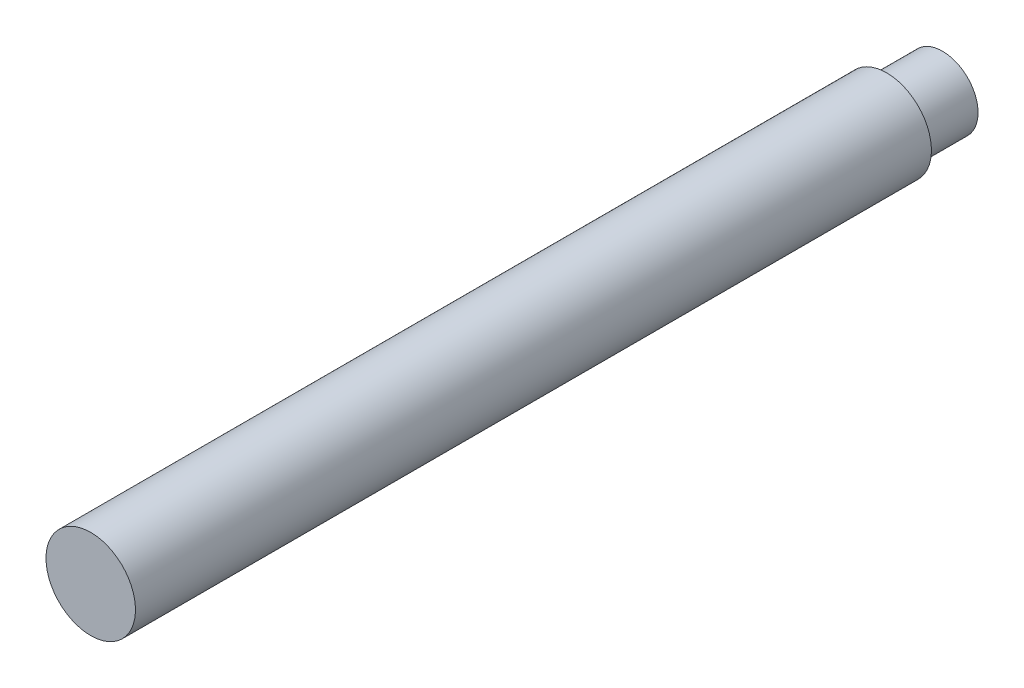
ISO-10303-21;
HEADER;
FILE_DESCRIPTION(('STEP AP214'),'2;1');
FILE_NAME('part.step','',(''),(''),'','','');
FILE_SCHEMA(('AUTOMOTIVE_DESIGN { 1 0 10303 214 1 1 1 1 }'));
ENDSEC;
DATA;
#1=APPLICATION_CONTEXT('core data for automotive mechanical design processes');
#2=APPLICATION_PROTOCOL_DEFINITION('international standard','automotive_design',2000,#1);
#3=PRODUCT_CONTEXT('',#1,'mechanical');
#4=PRODUCT('Part','Part','',(#3));
#5=PRODUCT_RELATED_PRODUCT_CATEGORY('part','',(#4));
#6=PRODUCT_DEFINITION_FORMATION('','',#4);
#7=PRODUCT_DEFINITION_CONTEXT('part definition',#1,'design');
#8=PRODUCT_DEFINITION('design','',#6,#7);
#9=PRODUCT_DEFINITION_SHAPE('','',#8);
#10=(LENGTH_UNIT() NAMED_UNIT(*) SI_UNIT(.MILLI.,.METRE.));
#11=(NAMED_UNIT(*) PLANE_ANGLE_UNIT() SI_UNIT($,.RADIAN.));
#12=(NAMED_UNIT(*) SI_UNIT($,.STERADIAN.) SOLID_ANGLE_UNIT());
#13=UNCERTAINTY_MEASURE_WITH_UNIT(LENGTH_MEASURE(1.E-05),#10,'distance_accuracy_value','');
#14=(GEOMETRIC_REPRESENTATION_CONTEXT(3) GLOBAL_UNCERTAINTY_ASSIGNED_CONTEXT((#13)) GLOBAL_UNIT_ASSIGNED_CONTEXT((#10,
#11,#12)) REPRESENTATION_CONTEXT('',''));
#15=CARTESIAN_POINT('',(0.,0.,0.));
#16=DIRECTION('',(0.,0.,1.));
#17=DIRECTION('',(1.,0.,0.));
#18=AXIS2_PLACEMENT_3D('',#15,#16,#17);
#19=CARTESIAN_POINT('',(0.,0.,76.2));
#20=DIRECTION('',(0.,0.,-1.));
#21=DIRECTION('',(-1.,0.,0.));
#22=AXIS2_PLACEMENT_3D('',#19,#20,#21);
#23=CYLINDRICAL_SURFACE('',#22,4.0005);
#24=CARTESIAN_POINT('',(0.,0.,76.2));
#25=DIRECTION('',(0.,0.,1.));
#26=DIRECTION('',(1.,0.,0.));
#27=AXIS2_PLACEMENT_3D('',#24,#25,#26);
#28=CIRCLE('',#27,4.0005);
#29=CARTESIAN_POINT('',(-4.0005,0.,76.2));
#30=VERTEX_POINT('',#29);
#31=EDGE_CURVE('E10',#30,#30,#28,.T.);
#32=CARTESIAN_POINT('',(0.,0.,5.));
#33=DIRECTION('',(0.,0.,-1.));
#34=DIRECTION('',(-1.,0.,0.));
#35=AXIS2_PLACEMENT_3D('',#32,#33,#34);
#36=CIRCLE('',#35,4.0005);
#37=CARTESIAN_POINT('',(-4.0005,0.,5.));
#38=VERTEX_POINT('',#37);
#39=EDGE_CURVE('E32',#38,#38,#36,.T.);
#40=CARTESIAN_POINT('',(-4.0005,0.,76.2));
#41=CARTESIAN_POINT('',(-4.0005,0.,75.4583333333333));
#42=CARTESIAN_POINT('',(-4.0005,0.,74.7166666666667));
#43=CARTESIAN_POINT('',(-4.0005,0.,73.2333333333333));
#44=CARTESIAN_POINT('',(-4.0005,0.,72.4916666666667));
#45=CARTESIAN_POINT('',(-4.0005,0.,71.0083333333333));
#46=CARTESIAN_POINT('',(-4.0005,0.,70.2666666666667));
#47=CARTESIAN_POINT('',(-4.0005,0.,68.7833333333333));
#48=CARTESIAN_POINT('',(-4.0005,0.,68.0416666666667));
#49=CARTESIAN_POINT('',(-4.0005,0.,66.5583333333333));
#50=CARTESIAN_POINT('',(-4.0005,0.,65.8166666666667));
#51=CARTESIAN_POINT('',(-4.0005,0.,64.3333333333333));
#52=CARTESIAN_POINT('',(-4.0005,0.,63.5916666666667));
#53=CARTESIAN_POINT('',(-4.0005,0.,62.1083333333333));
#54=CARTESIAN_POINT('',(-4.0005,0.,61.3666666666667));
#55=CARTESIAN_POINT('',(-4.0005,0.,59.8833333333333));
#56=CARTESIAN_POINT('',(-4.0005,0.,59.1416666666667));
#57=CARTESIAN_POINT('',(-4.0005,0.,57.6583333333333));
#58=CARTESIAN_POINT('',(-4.0005,0.,56.9166666666667));
#59=CARTESIAN_POINT('',(-4.0005,0.,55.4333333333333));
#60=CARTESIAN_POINT('',(-4.0005,0.,54.6916666666667));
#61=CARTESIAN_POINT('',(-4.0005,0.,53.2083333333333));
#62=CARTESIAN_POINT('',(-4.0005,0.,52.4666666666667));
#63=CARTESIAN_POINT('',(-4.0005,0.,50.9833333333333));
#64=CARTESIAN_POINT('',(-4.0005,0.,50.2416666666667));
#65=CARTESIAN_POINT('',(-4.0005,0.,48.7583333333333));
#66=CARTESIAN_POINT('',(-4.0005,0.,48.0166666666667));
#67=CARTESIAN_POINT('',(-4.0005,0.,46.5333333333333));
#68=CARTESIAN_POINT('',(-4.0005,0.,45.7916666666667));
#69=CARTESIAN_POINT('',(-4.0005,0.,44.3083333333333));
#70=CARTESIAN_POINT('',(-4.0005,0.,43.5666666666667));
#71=CARTESIAN_POINT('',(-4.0005,0.,42.0833333333333));
#72=CARTESIAN_POINT('',(-4.0005,0.,41.3416666666667));
#73=CARTESIAN_POINT('',(-4.0005,0.,39.8583333333333));
#74=CARTESIAN_POINT('',(-4.0005,0.,39.1166666666667));
#75=CARTESIAN_POINT('',(-4.0005,0.,37.6333333333333));
#76=CARTESIAN_POINT('',(-4.0005,0.,36.8916666666667));
#77=CARTESIAN_POINT('',(-4.0005,0.,35.4083333333333));
#78=CARTESIAN_POINT('',(-4.0005,0.,34.6666666666667));
#79=CARTESIAN_POINT('',(-4.0005,0.,33.1833333333333));
#80=CARTESIAN_POINT('',(-4.0005,0.,32.4416666666667));
#81=CARTESIAN_POINT('',(-4.0005,0.,30.9583333333333));
#82=CARTESIAN_POINT('',(-4.0005,0.,30.2166666666667));
#83=CARTESIAN_POINT('',(-4.0005,0.,28.7333333333333));
#84=CARTESIAN_POINT('',(-4.0005,0.,27.9916666666667));
#85=CARTESIAN_POINT('',(-4.0005,0.,26.5083333333333));
#86=CARTESIAN_POINT('',(-4.0005,0.,25.7666666666667));
#87=CARTESIAN_POINT('',(-4.0005,0.,24.2833333333333));
#88=CARTESIAN_POINT('',(-4.0005,0.,23.5416666666667));
#89=CARTESIAN_POINT('',(-4.0005,0.,22.0583333333333));
#90=CARTESIAN_POINT('',(-4.0005,0.,21.3166666666667));
#91=CARTESIAN_POINT('',(-4.0005,0.,19.8333333333333));
#92=CARTESIAN_POINT('',(-4.0005,0.,19.0916666666667));
#93=CARTESIAN_POINT('',(-4.0005,0.,17.6083333333333));
#94=CARTESIAN_POINT('',(-4.0005,0.,16.8666666666667));
#95=CARTESIAN_POINT('',(-4.0005,0.,15.3833333333333));
#96=CARTESIAN_POINT('',(-4.0005,0.,14.6416666666667));
#97=CARTESIAN_POINT('',(-4.0005,0.,13.1583333333333));
#98=CARTESIAN_POINT('',(-4.0005,0.,12.4166666666667));
#99=CARTESIAN_POINT('',(-4.0005,0.,10.9333333333333));
#100=CARTESIAN_POINT('',(-4.0005,0.,10.1916666666667));
#101=CARTESIAN_POINT('',(-4.0005,0.,8.70833333333334));
#102=CARTESIAN_POINT('',(-4.0005,0.,7.96666666666667));
#103=CARTESIAN_POINT('',(-4.0005,0.,6.48333333333334));
#104=CARTESIAN_POINT('',(-4.0005,0.,5.74166666666667));
#105=CARTESIAN_POINT('',(-4.0005,0.,5.));
#106=B_SPLINE_CURVE_WITH_KNOTS('',3,(#40,#41,#42,#43,#44,#45,#46,#47,#48,#49,#50,#51,#52,#53,
#54,#55,#56,#57,#58,#59,#60,#61,#62,#63,#64,#65,#66,#67,#68,#69,#70,#71,#72,#73,#74,#75,#76,#77,
#78,#79,#80,#81,#82,#83,#84,#85,#86,#87,#88,#89,#90,#91,#92,#93,#94,#95,#96,#97,#98,#99,#100,
#101,#102,#103,#104,#105),.UNSPECIFIED.,.F.,.F.,(4,2,2,2,2,2,2,2,2,2,2,2,2,2,2,2,2,2,2,2,2,2,2,
2,2,2,2,2,2,2,2,2,4),(0.,2.225,4.45000000000001,6.675,8.90000000000001,11.125,13.35,15.575,17.8,
20.025,22.25,24.475,26.7,28.925,31.15,33.375,35.6,37.825,40.05,42.275,44.5,46.725,48.95,51.175,
53.4,55.625,57.85,60.075,62.3,64.525,66.75,68.975,71.2),.UNSPECIFIED.);
#107=EDGE_CURVE('BSEAM29',#30,#38,#106,.T.);
#108=ORIENTED_EDGE('',*,*,#31,.F.);
#109=ORIENTED_EDGE('',*,*,#39,.F.);
#110=ORIENTED_EDGE('',*,*,#107,.T.);
#111=ORIENTED_EDGE('',*,*,#107,.F.);
#112=EDGE_LOOP('',(#108,#110,#109,#111));
#113=FACE_BOUND('',#112,.T.);
#114=ADVANCED_FACE('F29',(#113),#23,.T.);
#115=CARTESIAN_POINT('',(0.,0.,76.2));
#116=DIRECTION('',(0.,0.,1.));
#117=DIRECTION('',(1.,0.,0.));
#118=AXIS2_PLACEMENT_3D('',#115,#116,#117);
#119=PLANE('',#118);
#120=ORIENTED_EDGE('',*,*,#31,.T.);
#121=EDGE_LOOP('',(#120));
#122=FACE_BOUND('',#121,.T.);
#123=ADVANCED_FACE('F53',(#122),#119,.T.);
#124=CARTESIAN_POINT('',(0.,0.,5.));
#125=DIRECTION('',(0.,0.,-1.));
#126=DIRECTION('',(-1.,0.,0.));
#127=AXIS2_PLACEMENT_3D('',#124,#125,#126);
#128=PLANE('',#127);
#129=CARTESIAN_POINT('',(0.,0.,5.));
#130=DIRECTION('',(0.,0.,-1.));
#131=DIRECTION('',(-1.,0.,0.));
#132=AXIS2_PLACEMENT_3D('',#129,#130,#131);
#133=CIRCLE('',#132,3.175);
#134=CARTESIAN_POINT('',(-3.175,0.,5.));
#135=VERTEX_POINT('',#134);
#136=EDGE_CURVE('E39',#135,#135,#133,.T.);
#137=ORIENTED_EDGE('',*,*,#136,.F.);
#138=EDGE_LOOP('',(#137));
#139=FACE_BOUND('',#138,.T.);
#140=ORIENTED_EDGE('',*,*,#39,.T.);
#141=EDGE_LOOP('',(#140));
#142=FACE_BOUND('',#141,.T.);
#143=ADVANCED_FACE('F50',(#139,#142),#128,.T.);
#144=CARTESIAN_POINT('',(0.,0.,5.));
#145=DIRECTION('',(0.,0.,-1.));
#146=DIRECTION('',(-1.,0.,0.));
#147=AXIS2_PLACEMENT_3D('',#144,#145,#146);
#148=CYLINDRICAL_SURFACE('',#147,3.175);
#149=ORIENTED_EDGE('',*,*,#136,.T.);
#150=EDGE_LOOP('',(#149));
#151=FACE_BOUND('',#150,.T.);
#152=CARTESIAN_POINT('',(0.,0.,0.));
#153=DIRECTION('',(0.,0.,-1.));
#154=DIRECTION('',(-1.,0.,0.));
#155=AXIS2_PLACEMENT_3D('',#152,#153,#154);
#156=CIRCLE('',#155,3.175);
#157=CARTESIAN_POINT('',(-3.175,0.,0.));
#158=VERTEX_POINT('',#157);
#159=EDGE_CURVE('E41',#158,#158,#156,.T.);
#160=ORIENTED_EDGE('',*,*,#159,.F.);
#161=EDGE_LOOP('',(#160));
#162=FACE_BOUND('',#161,.T.);
#163=ADVANCED_FACE('F47',(#151,#162),#148,.T.);
#164=CARTESIAN_POINT('',(0.,0.,0.));
#165=DIRECTION('',(0.,0.,1.));
#166=DIRECTION('',(1.,0.,0.));
#167=AXIS2_PLACEMENT_3D('',#164,#165,#166);
#168=PLANE('',#167);
#169=ORIENTED_EDGE('',*,*,#159,.T.);
#170=EDGE_LOOP('',(#169));
#171=FACE_BOUND('',#170,.T.);
#172=ADVANCED_FACE('F68',(#171),#168,.F.);
#173=CLOSED_SHELL('',(#114,#123,#143,#163,#172));
#174=MANIFOLD_SOLID_BREP('B2',#173);
#175=ADVANCED_BREP_SHAPE_REPRESENTATION('',(#18,#174),#14);
#176=SHAPE_DEFINITION_REPRESENTATION(#9,#175);
ENDSEC;
END-ISO-10303-21;
